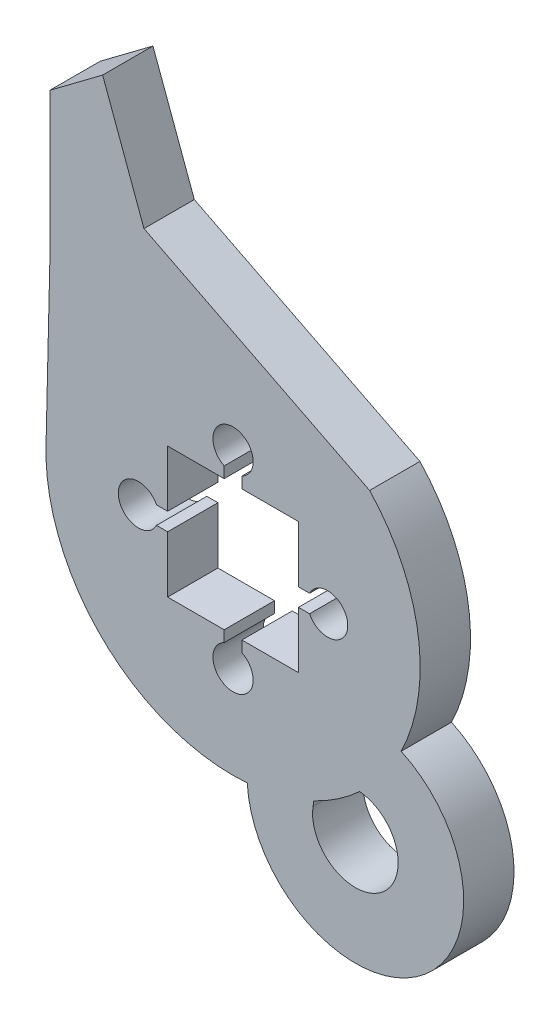
ISO-10303-21;
HEADER;
FILE_DESCRIPTION(('STEP AP214'),'2;1');
FILE_NAME('part.step','',(''),(''),'','','');
FILE_SCHEMA(('AUTOMOTIVE_DESIGN { 1 0 10303 214 1 1 1 1 }'));
ENDSEC;
DATA;
#1=APPLICATION_CONTEXT('core data for automotive mechanical design processes');
#2=APPLICATION_PROTOCOL_DEFINITION('international standard','automotive_design',2000,#1);
#3=PRODUCT_CONTEXT('',#1,'mechanical');
#4=PRODUCT('Part','Part','',(#3));
#5=PRODUCT_RELATED_PRODUCT_CATEGORY('part','',(#4));
#6=PRODUCT_DEFINITION_FORMATION('','',#4);
#7=PRODUCT_DEFINITION_CONTEXT('part definition',#1,'design');
#8=PRODUCT_DEFINITION('design','',#6,#7);
#9=PRODUCT_DEFINITION_SHAPE('','',#8);
#10=(LENGTH_UNIT() NAMED_UNIT(*) SI_UNIT(.MILLI.,.METRE.));
#11=(NAMED_UNIT(*) PLANE_ANGLE_UNIT() SI_UNIT($,.RADIAN.));
#12=(NAMED_UNIT(*) SI_UNIT($,.STERADIAN.) SOLID_ANGLE_UNIT());
#13=UNCERTAINTY_MEASURE_WITH_UNIT(LENGTH_MEASURE(1.E-05),#10,'distance_accuracy_value','');
#14=(GEOMETRIC_REPRESENTATION_CONTEXT(3) GLOBAL_UNCERTAINTY_ASSIGNED_CONTEXT((#13)) GLOBAL_UNIT_ASSIGNED_CONTEXT((#10,
#11,#12)) REPRESENTATION_CONTEXT('',''));
#15=CARTESIAN_POINT('',(0.,0.,0.));
#16=DIRECTION('',(0.,0.,1.));
#17=DIRECTION('',(1.,0.,0.));
#18=AXIS2_PLACEMENT_3D('',#15,#16,#17);
#19=CARTESIAN_POINT('',(0.,0.,6.35));
#20=DIRECTION('',(0.,0.,-1.));
#21=DIRECTION('',(-1.,0.,0.));
#22=AXIS2_PLACEMENT_3D('',#19,#20,#21);
#23=CYLINDRICAL_SURFACE('',#22,23.6135427551145);
#24=DIRECTION('',(0.,0.,-1.));
#25=VECTOR('',#24,1.);
#26=CARTESIAN_POINT('',(15.9784402053328,-17.3864559370858,3.175));
#27=LINE('',#26,#25);
#28=CARTESIAN_POINT('',(15.9784402053328,-17.3864559370858,6.35));
#29=VERTEX_POINT('',#28);
#30=CARTESIAN_POINT('',(15.9784402053328,-17.3864559370858,0.));
#31=VERTEX_POINT('',#30);
#32=EDGE_CURVE('E65',#29,#31,#27,.T.);
#33=ORIENTED_EDGE('',*,*,#32,.F.);
#34=CARTESIAN_POINT('',(0.,0.,6.35));
#35=DIRECTION('',(0.,0.,1.));
#36=DIRECTION('',(1.,0.,0.));
#37=AXIS2_PLACEMENT_3D('',#34,#35,#36);
#38=CIRCLE('',#37,23.6135427551145);
#39=CARTESIAN_POINT('',(10.1574341685378,-21.317268412239,6.35));
#40=VERTEX_POINT('',#39);
#41=EDGE_CURVE('E251',#40,#29,#38,.T.);
#42=ORIENTED_EDGE('',*,*,#41,.F.);
#43=DIRECTION('',(0.,0.,-1.));
#44=VECTOR('',#43,1.);
#45=CARTESIAN_POINT('',(10.1574341685378,-21.317268412239,3.175));
#46=LINE('',#45,#44);
#47=CARTESIAN_POINT('',(10.1574341685378,-21.317268412239,0.));
#48=VERTEX_POINT('',#47);
#49=EDGE_CURVE('E262',#40,#48,#46,.T.);
#50=ORIENTED_EDGE('',*,*,#49,.T.);
#51=CARTESIAN_POINT('',(0.,0.,0.));
#52=DIRECTION('',(0.,0.,1.));
#53=DIRECTION('',(1.,0.,0.));
#54=AXIS2_PLACEMENT_3D('',#51,#52,#53);
#55=CIRCLE('',#54,23.6135427551145);
#56=EDGE_CURVE('E411',#48,#31,#55,.T.);
#57=ORIENTED_EDGE('',*,*,#56,.T.);
#58=EDGE_LOOP('',(#33,#42,#50,#57));
#59=FACE_BOUND('',#58,.T.);
#60=ADVANCED_FACE('F40',(#59),#23,.T.);
#61=CARTESIAN_POINT('',(-23.5873627776474,1.11162882441667,0.));
#62=VERTEX_POINT('',#61);
#63=CARTESIAN_POINT('',(1.78936869988122,-23.5456484536635,0.));
#64=VERTEX_POINT('',#63);
#65=EDGE_CURVE('E408',#62,#64,#55,.T.);
#66=ORIENTED_EDGE('',*,*,#65,.T.);
#67=DIRECTION('',(0.,0.,-1.));
#68=VECTOR('',#67,1.);
#69=CARTESIAN_POINT('',(1.78936869988122,-23.5456484536635,3.175));
#70=LINE('',#69,#68);
#71=CARTESIAN_POINT('',(1.78936869988122,-23.5456484536635,6.35));
#72=VERTEX_POINT('',#71);
#73=EDGE_CURVE('E271',#64,#72,#70,.F.);
#74=ORIENTED_EDGE('',*,*,#73,.T.);
#75=CARTESIAN_POINT('',(-23.5873627776474,1.11162882441667,6.35));
#76=VERTEX_POINT('',#75);
#77=EDGE_CURVE('E336',#76,#72,#38,.T.);
#78=ORIENTED_EDGE('',*,*,#77,.F.);
#79=DIRECTION('',(0.,0.,-1.));
#80=VECTOR('',#79,1.);
#81=CARTESIAN_POINT('',(-23.5873627776474,1.11162882441667,6.35));
#82=LINE('',#81,#80);
#83=EDGE_CURVE('E11',#76,#62,#82,.T.);
#84=ORIENTED_EDGE('',*,*,#83,.T.);
#85=EDGE_LOOP('',(#66,#74,#78,#84));
#86=FACE_BOUND('',#85,.T.);
#87=ADVANCED_FACE('F568',(#86),#23,.T.);
#88=CARTESIAN_POINT('',(-23.600452766381,0.555814412208336,6.35));
#89=DIRECTION('',(0.9997227903611,-0.0235444777520275,0.));
#90=DIRECTION('',(0.0235444777520275,0.9997227903611,0.));
#91=AXIS2_PLACEMENT_3D('',#88,#89,#90);
#92=PLANE('',#91);
#93=DIRECTION('',(-0.0235444777520275,-0.9997227903611,0.));
#94=VECTOR('',#93,1.);
#95=CARTESIAN_POINT('',(-23.600452766381,0.555814412208336,0.));
#96=LINE('',#95,#94);
#97=CARTESIAN_POINT('',(-23.0807397820959,22.6233633427269,0.));
#98=VERTEX_POINT('',#97);
#99=EDGE_CURVE('E404',#98,#62,#96,.T.);
#100=ORIENTED_EDGE('',*,*,#99,.T.);
#101=ORIENTED_EDGE('',*,*,#83,.F.);
#102=DIRECTION('',(-0.0235444777520275,-0.9997227903611,0.));
#103=VECTOR('',#102,1.);
#104=CARTESIAN_POINT('',(-23.600452766381,0.555814412208336,6.35));
#105=LINE('',#104,#103);
#106=CARTESIAN_POINT('',(-23.0807397820959,22.6233633427269,6.35));
#107=VERTEX_POINT('',#106);
#108=EDGE_CURVE('E333',#107,#76,#105,.T.);
#109=ORIENTED_EDGE('',*,*,#108,.F.);
#110=DIRECTION('',(0.,0.,-1.));
#111=VECTOR('',#110,1.);
#112=CARTESIAN_POINT('',(-23.0807397820959,22.6233633427269,6.35));
#113=LINE('',#112,#111);
#114=EDGE_CURVE('E418',#107,#98,#113,.T.);
#115=ORIENTED_EDGE('',*,*,#114,.T.);
#116=EDGE_LOOP('',(#100,#101,#109,#115));
#117=FACE_BOUND('',#116,.T.);
#118=ADVANCED_FACE('F574',(#117),#92,.F.);
#119=CARTESIAN_POINT('',(21.2141693512526,-10.371037565451,6.35));
#120=VERTEX_POINT('',#119);
#121=CARTESIAN_POINT('',(17.2333916296905,16.1434077686631,6.35));
#122=VERTEX_POINT('',#121);
#123=EDGE_CURVE('E57',#120,#122,#38,.T.);
#124=ORIENTED_EDGE('',*,*,#123,.F.);
#125=DIRECTION('',(0.,0.,-1.));
#126=VECTOR('',#125,1.);
#127=CARTESIAN_POINT('',(21.2141693512526,-10.371037565451,3.175));
#128=LINE('',#127,#126);
#129=CARTESIAN_POINT('',(21.2141693512526,-10.371037565451,0.));
#130=VERTEX_POINT('',#129);
#131=EDGE_CURVE('E269',#120,#130,#128,.T.);
#132=ORIENTED_EDGE('',*,*,#131,.T.);
#133=CARTESIAN_POINT('',(17.2333916296905,16.1434077686631,0.));
#134=VERTEX_POINT('',#133);
#135=EDGE_CURVE('E407',#130,#134,#55,.T.);
#136=ORIENTED_EDGE('',*,*,#135,.T.);
#137=DIRECTION('',(0.,0.,-1.));
#138=VECTOR('',#137,1.);
#139=CARTESIAN_POINT('',(17.2333916296905,16.1434077686631,6.35));
#140=LINE('',#139,#138);
#141=EDGE_CURVE('E49',#122,#134,#140,.T.);
#142=ORIENTED_EDGE('',*,*,#141,.F.);
#143=EDGE_LOOP('',(#124,#132,#136,#142));
#144=FACE_BOUND('',#143,.T.);
#145=ADVANCED_FACE('F570',(#144),#23,.T.);
#146=CARTESIAN_POINT('',(9.99702081095458,19.7975110321155,6.35));
#147=DIRECTION('',(-0.450754622668635,-0.892647898189906,0.));
#148=DIRECTION('',(0.892647898189906,-0.450754622668635,0.));
#149=AXIS2_PLACEMENT_3D('',#146,#147,#148);
#150=PLANE('',#149);
#151=DIRECTION('',(-0.892647898189906,0.450754622668635,0.));
#152=VECTOR('',#151,1.);
#153=CARTESIAN_POINT('',(9.99702081095458,19.7975110321155,0.));
#154=LINE('',#153,#152);
#155=CARTESIAN_POINT('',(-11.2389809229268,30.5209171679016,0.));
#156=VERTEX_POINT('',#155);
#157=EDGE_CURVE('E410',#134,#156,#154,.T.);
#158=ORIENTED_EDGE('',*,*,#157,.T.);
#159=DIRECTION('',(0.,0.,-1.));
#160=VECTOR('',#159,1.);
#161=CARTESIAN_POINT('',(-11.2389809229268,30.5209171679016,6.35));
#162=LINE('',#161,#160);
#163=CARTESIAN_POINT('',(-11.2389809229268,30.5209171679016,6.35));
#164=VERTEX_POINT('',#163);
#165=EDGE_CURVE('E427',#164,#156,#162,.T.);
#166=ORIENTED_EDGE('',*,*,#165,.F.);
#167=DIRECTION('',(-0.892647898189906,0.450754622668635,0.));
#168=VECTOR('',#167,1.);
#169=CARTESIAN_POINT('',(9.99702081095458,19.7975110321155,6.35));
#170=LINE('',#169,#168);
#171=EDGE_CURVE('E339',#122,#164,#170,.T.);
#172=ORIENTED_EDGE('',*,*,#171,.F.);
#173=ORIENTED_EDGE('',*,*,#141,.T.);
#174=EDGE_LOOP('',(#158,#166,#172,#173));
#175=FACE_BOUND('',#174,.T.);
#176=ADVANCED_FACE('F579',(#175),#150,.F.);
#177=CARTESIAN_POINT('',(0.,0.,6.35));
#178=DIRECTION('',(-0.938398633522792,-0.345554633310792,0.));
#179=DIRECTION('',(0.345554633310792,-0.938398633522793,0.));
#180=AXIS2_PLACEMENT_3D('',#177,#178,#179);
#181=PLANE('',#180);
#182=DIRECTION('',(-0.345554633310792,0.938398633522793,0.));
#183=VECTOR('',#182,1.);
#184=CARTESIAN_POINT('',(0.,0.,0.));
#185=LINE('',#184,#183);
#186=CARTESIAN_POINT('',(-16.4570394114265,44.691234921523,0.));
#187=VERTEX_POINT('',#186);
#188=EDGE_CURVE('E413',#156,#187,#185,.T.);
#189=ORIENTED_EDGE('',*,*,#188,.T.);
#190=DIRECTION('',(0.,0.,-1.));
#191=VECTOR('',#190,1.);
#192=CARTESIAN_POINT('',(-16.4570394114265,44.691234921523,6.35));
#193=LINE('',#192,#191);
#194=CARTESIAN_POINT('',(-16.4570394114265,44.691234921523,6.35));
#195=VERTEX_POINT('',#194);
#196=EDGE_CURVE('E424',#195,#187,#193,.T.);
#197=ORIENTED_EDGE('',*,*,#196,.F.);
#198=DIRECTION('',(-0.345554633310792,0.938398633522793,0.));
#199=VECTOR('',#198,1.);
#200=CARTESIAN_POINT('',(0.,0.,6.35));
#201=LINE('',#200,#199);
#202=EDGE_CURVE('E341',#164,#195,#201,.T.);
#203=ORIENTED_EDGE('',*,*,#202,.F.);
#204=ORIENTED_EDGE('',*,*,#165,.T.);
#205=EDGE_LOOP('',(#189,#197,#203,#204));
#206=FACE_BOUND('',#205,.T.);
#207=ADVANCED_FACE('F584',(#206),#181,.F.);
#208=CARTESIAN_POINT('',(-27.3756816624643,36.5026420511175,6.35));
#209=DIRECTION('',(0.599981766977011,-0.800013674442596,0.));
#210=DIRECTION('',(0.800013674442596,0.599981766977011,0.));
#211=AXIS2_PLACEMENT_3D('',#208,#209,#210);
#212=PLANE('',#211);
#213=DIRECTION('',(-0.800013674442596,-0.599981766977011,0.));
#214=VECTOR('',#213,1.);
#215=CARTESIAN_POINT('',(-27.3756816624643,36.5026420511175,0.));
#216=LINE('',#215,#214);
#217=CARTESIAN_POINT('',(-23.1206338335875,39.6937763985647,0.));
#218=VERTEX_POINT('',#217);
#219=EDGE_CURVE('E415',#187,#218,#216,.T.);
#220=ORIENTED_EDGE('',*,*,#219,.T.);
#221=DIRECTION('',(0.,0.,-1.));
#222=VECTOR('',#221,1.);
#223=CARTESIAN_POINT('',(-23.1206338335875,39.6937763985647,6.35));
#224=LINE('',#223,#222);
#225=CARTESIAN_POINT('',(-23.1206338335875,39.6937763985647,6.35));
#226=VERTEX_POINT('',#225);
#227=EDGE_CURVE('E421',#226,#218,#224,.T.);
#228=ORIENTED_EDGE('',*,*,#227,.F.);
#229=DIRECTION('',(-0.800013674442596,-0.599981766977011,0.));
#230=VECTOR('',#229,1.);
#231=CARTESIAN_POINT('',(-27.3756816624643,36.5026420511175,6.35));
#232=LINE('',#231,#230);
#233=EDGE_CURVE('E343',#195,#226,#232,.T.);
#234=ORIENTED_EDGE('',*,*,#233,.F.);
#235=ORIENTED_EDGE('',*,*,#196,.T.);
#236=EDGE_LOOP('',(#220,#228,#234,#235));
#237=FACE_BOUND('',#236,.T.);
#238=ADVANCED_FACE('F609',(#237),#212,.F.);
#239=CARTESIAN_POINT('',(0.,11.938,6.35));
#240=DIRECTION('',(0.,0.,-1.));
#241=DIRECTION('',(-1.,0.,0.));
#242=AXIS2_PLACEMENT_3D('',#239,#240,#241);
#243=CYLINDRICAL_SURFACE('',#242,2.54);
#244=CARTESIAN_POINT('',(0.,11.938,0.));
#245=DIRECTION('',(0.,0.,1.));
#246=DIRECTION('',(1.,0.,0.));
#247=AXIS2_PLACEMENT_3D('',#244,#245,#246);
#248=CIRCLE('',#247,2.54);
#249=CARTESIAN_POINT('',(1.1176,9.65708565702261,0.));
#250=VERTEX_POINT('',#249);
#251=CARTESIAN_POINT('',(-1.1176,9.65708565702261,0.));
#252=VERTEX_POINT('',#251);
#253=EDGE_CURVE('E279',#250,#252,#248,.T.);
#254=ORIENTED_EDGE('',*,*,#253,.F.);
#255=DIRECTION('',(0.,0.,-1.));
#256=VECTOR('',#255,1.);
#257=CARTESIAN_POINT('',(1.1176,9.65708565702261,6.35));
#258=LINE('',#257,#256);
#259=CARTESIAN_POINT('',(1.1176,9.65708565702261,6.35));
#260=VERTEX_POINT('',#259);
#261=EDGE_CURVE('E44',#260,#250,#258,.T.);
#262=ORIENTED_EDGE('',*,*,#261,.F.);
#263=CARTESIAN_POINT('',(0.,11.938,6.35));
#264=DIRECTION('',(0.,0.,1.));
#265=DIRECTION('',(1.,0.,0.));
#266=AXIS2_PLACEMENT_3D('',#263,#264,#265);
#267=CIRCLE('',#266,2.54);
#268=CARTESIAN_POINT('',(-1.1176,9.65708565702261,6.35));
#269=VERTEX_POINT('',#268);
#270=EDGE_CURVE('E280',#260,#269,#267,.T.);
#271=ORIENTED_EDGE('',*,*,#270,.T.);
#272=DIRECTION('',(0.,0.,-1.));
#273=VECTOR('',#272,1.);
#274=CARTESIAN_POINT('',(-1.1176,9.65708565702261,6.35));
#275=LINE('',#274,#273);
#276=EDGE_CURVE('E347',#269,#252,#275,.T.);
#277=ORIENTED_EDGE('',*,*,#276,.T.);
#278=EDGE_LOOP('',(#254,#262,#271,#277));
#279=FACE_BOUND('',#278,.T.);
#280=ADVANCED_FACE('F42',(#279),#243,.F.);
#281=CARTESIAN_POINT('',(1.1176,0.,6.35));
#282=DIRECTION('',(1.,0.,0.));
#283=DIRECTION('',(0.,1.,0.));
#284=AXIS2_PLACEMENT_3D('',#281,#282,#283);
#285=PLANE('',#284);
#286=DIRECTION('',(0.,-1.,0.));
#287=VECTOR('',#286,1.);
#288=CARTESIAN_POINT('',(1.1176,0.,0.));
#289=LINE('',#288,#287);
#290=CARTESIAN_POINT('',(1.1176,8.255,0.));
#291=VERTEX_POINT('',#290);
#292=EDGE_CURVE('E350',#250,#291,#289,.T.);
#293=ORIENTED_EDGE('',*,*,#292,.T.);
#294=DIRECTION('',(0.,0.,-1.));
#295=VECTOR('',#294,1.);
#296=CARTESIAN_POINT('',(1.1176,8.255,6.35));
#297=LINE('',#296,#295);
#298=CARTESIAN_POINT('',(1.1176,8.255,6.35));
#299=VERTEX_POINT('',#298);
#300=EDGE_CURVE('E468',#299,#291,#297,.T.);
#301=ORIENTED_EDGE('',*,*,#300,.F.);
#302=DIRECTION('',(0.,-1.,0.));
#303=VECTOR('',#302,1.);
#304=CARTESIAN_POINT('',(1.1176,0.,6.35));
#305=LINE('',#304,#303);
#306=EDGE_CURVE('E283',#260,#299,#305,.T.);
#307=ORIENTED_EDGE('',*,*,#306,.F.);
#308=ORIENTED_EDGE('',*,*,#261,.T.);
#309=EDGE_LOOP('',(#293,#301,#307,#308));
#310=FACE_BOUND('',#309,.T.);
#311=ADVANCED_FACE('F477',(#310),#285,.F.);
#312=CARTESIAN_POINT('',(0.,8.255,6.35));
#313=DIRECTION('',(0.,1.,0.));
#314=DIRECTION('',(0.,0.,1.));
#315=AXIS2_PLACEMENT_3D('',#312,#313,#314);
#316=PLANE('',#315);
#317=DIRECTION('',(1.,0.,0.));
#318=VECTOR('',#317,1.);
#319=CARTESIAN_POINT('',(0.,8.255,0.));
#320=LINE('',#319,#318);
#321=CARTESIAN_POINT('',(8.255,8.255,0.));
#322=VERTEX_POINT('',#321);
#323=EDGE_CURVE('E352',#291,#322,#320,.T.);
#324=ORIENTED_EDGE('',*,*,#323,.T.);
#325=DIRECTION('',(0.,0.,-1.));
#326=VECTOR('',#325,1.);
#327=CARTESIAN_POINT('',(8.255,8.255,6.35));
#328=LINE('',#327,#326);
#329=CARTESIAN_POINT('',(8.255,8.255,6.35));
#330=VERTEX_POINT('',#329);
#331=EDGE_CURVE('E466',#330,#322,#328,.T.);
#332=ORIENTED_EDGE('',*,*,#331,.F.);
#333=DIRECTION('',(1.,0.,0.));
#334=VECTOR('',#333,1.);
#335=CARTESIAN_POINT('',(0.,8.255,6.35));
#336=LINE('',#335,#334);
#337=EDGE_CURVE('E286',#299,#330,#336,.T.);
#338=ORIENTED_EDGE('',*,*,#337,.F.);
#339=ORIENTED_EDGE('',*,*,#300,.T.);
#340=EDGE_LOOP('',(#324,#332,#338,#339));
#341=FACE_BOUND('',#340,.T.);
#342=ADVANCED_FACE('F556',(#341),#316,.F.);
#343=CARTESIAN_POINT('',(8.255,0.,6.35));
#344=DIRECTION('',(1.,0.,0.));
#345=DIRECTION('',(0.,0.,-1.));
#346=AXIS2_PLACEMENT_3D('',#343,#344,#345);
#347=PLANE('',#346);
#348=DIRECTION('',(0.,-1.,0.));
#349=VECTOR('',#348,1.);
#350=CARTESIAN_POINT('',(8.255,0.,0.));
#351=LINE('',#350,#349);
#352=CARTESIAN_POINT('',(8.255,1.1176,0.));
#353=VERTEX_POINT('',#352);
#354=EDGE_CURVE('E354',#322,#353,#351,.T.);
#355=ORIENTED_EDGE('',*,*,#354,.T.);
#356=DIRECTION('',(0.,0.,-1.));
#357=VECTOR('',#356,1.);
#358=CARTESIAN_POINT('',(8.255,1.1176,6.35));
#359=LINE('',#358,#357);
#360=CARTESIAN_POINT('',(8.255,1.1176,6.35));
#361=VERTEX_POINT('',#360);
#362=EDGE_CURVE('E463',#361,#353,#359,.T.);
#363=ORIENTED_EDGE('',*,*,#362,.F.);
#364=DIRECTION('',(0.,-1.,0.));
#365=VECTOR('',#364,1.);
#366=CARTESIAN_POINT('',(8.255,0.,6.35));
#367=LINE('',#366,#365);
#368=EDGE_CURVE('E288',#330,#361,#367,.T.);
#369=ORIENTED_EDGE('',*,*,#368,.F.);
#370=ORIENTED_EDGE('',*,*,#331,.T.);
#371=EDGE_LOOP('',(#355,#363,#369,#370));
#372=FACE_BOUND('',#371,.T.);
#373=ADVANCED_FACE('F554',(#372),#347,.F.);
#374=CARTESIAN_POINT('',(0.,1.1176,6.35));
#375=DIRECTION('',(0.,1.,0.));
#376=DIRECTION('',(0.,0.,1.));
#377=AXIS2_PLACEMENT_3D('',#374,#375,#376);
#378=PLANE('',#377);
#379=DIRECTION('',(1.,0.,0.));
#380=VECTOR('',#379,1.);
#381=CARTESIAN_POINT('',(0.,1.1176,0.));
#382=LINE('',#381,#380);
#383=CARTESIAN_POINT('',(9.6570856570226,1.1176,0.));
#384=VERTEX_POINT('',#383);
#385=EDGE_CURVE('E356',#353,#384,#382,.T.);
#386=ORIENTED_EDGE('',*,*,#385,.T.);
#387=DIRECTION('',(0.,0.,-1.));
#388=VECTOR('',#387,1.);
#389=CARTESIAN_POINT('',(9.6570856570226,1.1176,6.35));
#390=LINE('',#389,#388);
#391=CARTESIAN_POINT('',(9.6570856570226,1.1176,6.35));
#392=VERTEX_POINT('',#391);
#393=EDGE_CURVE('E461',#392,#384,#390,.T.);
#394=ORIENTED_EDGE('',*,*,#393,.F.);
#395=DIRECTION('',(1.,0.,0.));
#396=VECTOR('',#395,1.);
#397=CARTESIAN_POINT('',(0.,1.1176,6.35));
#398=LINE('',#397,#396);
#399=EDGE_CURVE('E290',#361,#392,#398,.T.);
#400=ORIENTED_EDGE('',*,*,#399,.F.);
#401=ORIENTED_EDGE('',*,*,#362,.T.);
#402=EDGE_LOOP('',(#386,#394,#400,#401));
#403=FACE_BOUND('',#402,.T.);
#404=ADVANCED_FACE('F549',(#403),#378,.F.);
#405=CARTESIAN_POINT('',(11.938,0.,6.35));
#406=DIRECTION('',(0.,0.,-1.));
#407=DIRECTION('',(-1.,0.,0.));
#408=AXIS2_PLACEMENT_3D('',#405,#406,#407);
#409=CYLINDRICAL_SURFACE('',#408,2.54);
#410=CARTESIAN_POINT('',(11.938,0.,0.));
#411=DIRECTION('',(0.,0.,1.));
#412=DIRECTION('',(1.,0.,0.));
#413=AXIS2_PLACEMENT_3D('',#410,#411,#412);
#414=CIRCLE('',#413,2.54);
#415=CARTESIAN_POINT('',(9.6570856570226,-1.1176,0.));
#416=VERTEX_POINT('',#415);
#417=EDGE_CURVE('E359',#416,#384,#414,.T.);
#418=ORIENTED_EDGE('',*,*,#417,.F.);
#419=DIRECTION('',(0.,0.,-1.));
#420=VECTOR('',#419,1.);
#421=CARTESIAN_POINT('',(9.6570856570226,-1.1176,6.35));
#422=LINE('',#421,#420);
#423=CARTESIAN_POINT('',(9.6570856570226,-1.1176,6.35));
#424=VERTEX_POINT('',#423);
#425=EDGE_CURVE('E459',#424,#416,#422,.T.);
#426=ORIENTED_EDGE('',*,*,#425,.F.);
#427=CARTESIAN_POINT('',(11.938,0.,6.35));
#428=DIRECTION('',(0.,0.,1.));
#429=DIRECTION('',(1.,0.,0.));
#430=AXIS2_PLACEMENT_3D('',#427,#428,#429);
#431=CIRCLE('',#430,2.54);
#432=EDGE_CURVE('E292',#424,#392,#431,.T.);
#433=ORIENTED_EDGE('',*,*,#432,.T.);
#434=ORIENTED_EDGE('',*,*,#393,.T.);
#435=EDGE_LOOP('',(#418,#426,#433,#434));
#436=FACE_BOUND('',#435,.T.);
#437=ADVANCED_FACE('F545',(#436),#409,.F.);
#438=CARTESIAN_POINT('',(0.,-1.1176,6.35));
#439=DIRECTION('',(0.,1.,0.));
#440=DIRECTION('',(0.,0.,1.));
#441=AXIS2_PLACEMENT_3D('',#438,#439,#440);
#442=PLANE('',#441);
#443=DIRECTION('',(1.,0.,0.));
#444=VECTOR('',#443,1.);
#445=CARTESIAN_POINT('',(0.,-1.1176,0.));
#446=LINE('',#445,#444);
#447=CARTESIAN_POINT('',(8.255,-1.1176,0.));
#448=VERTEX_POINT('',#447);
#449=EDGE_CURVE('E362',#448,#416,#446,.T.);
#450=ORIENTED_EDGE('',*,*,#449,.F.);
#451=DIRECTION('',(0.,0.,-1.));
#452=VECTOR('',#451,1.);
#453=CARTESIAN_POINT('',(8.255,-1.1176,6.35));
#454=LINE('',#453,#452);
#455=CARTESIAN_POINT('',(8.255,-1.1176,6.35));
#456=VERTEX_POINT('',#455);
#457=EDGE_CURVE('E457',#456,#448,#454,.T.);
#458=ORIENTED_EDGE('',*,*,#457,.F.);
#459=DIRECTION('',(1.,0.,0.));
#460=VECTOR('',#459,1.);
#461=CARTESIAN_POINT('',(0.,-1.1176,6.35));
#462=LINE('',#461,#460);
#463=EDGE_CURVE('E295',#456,#424,#462,.T.);
#464=ORIENTED_EDGE('',*,*,#463,.T.);
#465=ORIENTED_EDGE('',*,*,#425,.T.);
#466=EDGE_LOOP('',(#450,#458,#464,#465));
#467=FACE_BOUND('',#466,.T.);
#468=ADVANCED_FACE('F539',(#467),#442,.T.);
#469=CARTESIAN_POINT('',(8.255,0.,6.35));
#470=DIRECTION('',(1.,0.,0.));
#471=DIRECTION('',(0.,0.,-1.));
#472=AXIS2_PLACEMENT_3D('',#469,#470,#471);
#473=PLANE('',#472);
#474=DIRECTION('',(0.,-1.,0.));
#475=VECTOR('',#474,1.);
#476=CARTESIAN_POINT('',(8.255,0.,0.));
#477=LINE('',#476,#475);
#478=CARTESIAN_POINT('',(8.255,-8.255,0.));
#479=VERTEX_POINT('',#478);
#480=EDGE_CURVE('E365',#448,#479,#477,.T.);
#481=ORIENTED_EDGE('',*,*,#480,.T.);
#482=DIRECTION('',(0.,0.,-1.));
#483=VECTOR('',#482,1.);
#484=CARTESIAN_POINT('',(8.255,-8.255,6.35));
#485=LINE('',#484,#483);
#486=CARTESIAN_POINT('',(8.255,-8.255,6.35));
#487=VERTEX_POINT('',#486);
#488=EDGE_CURVE('E455',#487,#479,#485,.T.);
#489=ORIENTED_EDGE('',*,*,#488,.F.);
#490=DIRECTION('',(0.,-1.,0.));
#491=VECTOR('',#490,1.);
#492=CARTESIAN_POINT('',(8.255,0.,6.35));
#493=LINE('',#492,#491);
#494=EDGE_CURVE('E298',#456,#487,#493,.T.);
#495=ORIENTED_EDGE('',*,*,#494,.F.);
#496=ORIENTED_EDGE('',*,*,#457,.T.);
#497=EDGE_LOOP('',(#481,#489,#495,#496));
#498=FACE_BOUND('',#497,.T.);
#499=ADVANCED_FACE('F687',(#498),#473,.F.);
#500=CARTESIAN_POINT('',(0.,-8.255,6.35));
#501=DIRECTION('',(0.,1.,0.));
#502=DIRECTION('',(0.,0.,1.));
#503=AXIS2_PLACEMENT_3D('',#500,#501,#502);
#504=PLANE('',#503);
#505=DIRECTION('',(1.,0.,0.));
#506=VECTOR('',#505,1.);
#507=CARTESIAN_POINT('',(0.,-8.255,0.));
#508=LINE('',#507,#506);
#509=CARTESIAN_POINT('',(1.1176,-8.255,0.));
#510=VERTEX_POINT('',#509);
#511=EDGE_CURVE('E368',#510,#479,#508,.T.);
#512=ORIENTED_EDGE('',*,*,#511,.F.);
#513=DIRECTION('',(0.,0.,-1.));
#514=VECTOR('',#513,1.);
#515=CARTESIAN_POINT('',(1.1176,-8.255,6.35));
#516=LINE('',#515,#514);
#517=CARTESIAN_POINT('',(1.1176,-8.255,6.35));
#518=VERTEX_POINT('',#517);
#519=EDGE_CURVE('E453',#518,#510,#516,.T.);
#520=ORIENTED_EDGE('',*,*,#519,.F.);
#521=DIRECTION('',(1.,0.,0.));
#522=VECTOR('',#521,1.);
#523=CARTESIAN_POINT('',(0.,-8.255,6.35));
#524=LINE('',#523,#522);
#525=EDGE_CURVE('E300',#518,#487,#524,.T.);
#526=ORIENTED_EDGE('',*,*,#525,.T.);
#527=ORIENTED_EDGE('',*,*,#488,.T.);
#528=EDGE_LOOP('',(#512,#520,#526,#527));
#529=FACE_BOUND('',#528,.T.);
#530=ADVANCED_FACE('F533',(#529),#504,.T.);
#531=CARTESIAN_POINT('',(1.11760000000001,0.,6.35));
#532=DIRECTION('',(1.,0.,0.));
#533=DIRECTION('',(0.,1.,0.));
#534=AXIS2_PLACEMENT_3D('',#531,#532,#533);
#535=PLANE('',#534);
#536=DIRECTION('',(0.,-1.,0.));
#537=VECTOR('',#536,1.);
#538=CARTESIAN_POINT('',(1.11760000000001,0.,0.));
#539=LINE('',#538,#537);
#540=CARTESIAN_POINT('',(1.1176,-9.65708565702261,0.));
#541=VERTEX_POINT('',#540);
#542=EDGE_CURVE('E371',#510,#541,#539,.T.);
#543=ORIENTED_EDGE('',*,*,#542,.T.);
#544=DIRECTION('',(0.,0.,-1.));
#545=VECTOR('',#544,1.);
#546=CARTESIAN_POINT('',(1.1176,-9.65708565702261,6.35));
#547=LINE('',#546,#545);
#548=CARTESIAN_POINT('',(1.1176,-9.65708565702261,6.35));
#549=VERTEX_POINT('',#548);
#550=EDGE_CURVE('E451',#549,#541,#547,.T.);
#551=ORIENTED_EDGE('',*,*,#550,.F.);
#552=DIRECTION('',(0.,-1.,0.));
#553=VECTOR('',#552,1.);
#554=CARTESIAN_POINT('',(1.11760000000001,0.,6.35));
#555=LINE('',#554,#553);
#556=EDGE_CURVE('E303',#518,#549,#555,.T.);
#557=ORIENTED_EDGE('',*,*,#556,.F.);
#558=ORIENTED_EDGE('',*,*,#519,.T.);
#559=EDGE_LOOP('',(#543,#551,#557,#558));
#560=FACE_BOUND('',#559,.T.);
#561=ADVANCED_FACE('F530',(#560),#535,.F.);
#562=CARTESIAN_POINT('',(0.,-11.938,6.35));
#563=DIRECTION('',(0.,0.,-1.));
#564=DIRECTION('',(-1.,0.,0.));
#565=AXIS2_PLACEMENT_3D('',#562,#563,#564);
#566=CYLINDRICAL_SURFACE('',#565,2.54);
#567=CARTESIAN_POINT('',(0.,-11.938,0.));
#568=DIRECTION('',(0.,0.,1.));
#569=DIRECTION('',(1.,0.,0.));
#570=AXIS2_PLACEMENT_3D('',#567,#568,#569);
#571=CIRCLE('',#570,2.54);
#572=CARTESIAN_POINT('',(-1.1176,-9.65708565702261,0.));
#573=VERTEX_POINT('',#572);
#574=EDGE_CURVE('E374',#573,#541,#571,.T.);
#575=ORIENTED_EDGE('',*,*,#574,.F.);
#576=DIRECTION('',(0.,0.,-1.));
#577=VECTOR('',#576,1.);
#578=CARTESIAN_POINT('',(-1.1176,-9.65708565702261,6.35));
#579=LINE('',#578,#577);
#580=CARTESIAN_POINT('',(-1.1176,-9.65708565702261,6.35));
#581=VERTEX_POINT('',#580);
#582=EDGE_CURVE('E449',#581,#573,#579,.T.);
#583=ORIENTED_EDGE('',*,*,#582,.F.);
#584=CARTESIAN_POINT('',(0.,-11.938,6.35));
#585=DIRECTION('',(0.,0.,1.));
#586=DIRECTION('',(1.,0.,0.));
#587=AXIS2_PLACEMENT_3D('',#584,#585,#586);
#588=CIRCLE('',#587,2.54);
#589=EDGE_CURVE('E305',#581,#549,#588,.T.);
#590=ORIENTED_EDGE('',*,*,#589,.T.);
#591=ORIENTED_EDGE('',*,*,#550,.T.);
#592=EDGE_LOOP('',(#575,#583,#590,#591));
#593=FACE_BOUND('',#592,.T.);
#594=ADVANCED_FACE('F525',(#593),#566,.F.);
#595=CARTESIAN_POINT('',(-1.1176,0.,6.35));
#596=DIRECTION('',(1.,0.,0.));
#597=DIRECTION('',(0.,0.,-1.));
#598=AXIS2_PLACEMENT_3D('',#595,#596,#597);
#599=PLANE('',#598);
#600=DIRECTION('',(0.,-1.,0.));
#601=VECTOR('',#600,1.);
#602=CARTESIAN_POINT('',(-1.1176,0.,0.));
#603=LINE('',#602,#601);
#604=CARTESIAN_POINT('',(-1.1176,-8.255,0.));
#605=VERTEX_POINT('',#604);
#606=EDGE_CURVE('E377',#605,#573,#603,.T.);
#607=ORIENTED_EDGE('',*,*,#606,.F.);
#608=DIRECTION('',(0.,0.,-1.));
#609=VECTOR('',#608,1.);
#610=CARTESIAN_POINT('',(-1.1176,-8.255,6.35));
#611=LINE('',#610,#609);
#612=CARTESIAN_POINT('',(-1.1176,-8.255,6.35));
#613=VERTEX_POINT('',#612);
#614=EDGE_CURVE('E447',#613,#605,#611,.T.);
#615=ORIENTED_EDGE('',*,*,#614,.F.);
#616=DIRECTION('',(0.,-1.,0.));
#617=VECTOR('',#616,1.);
#618=CARTESIAN_POINT('',(-1.1176,0.,6.35));
#619=LINE('',#618,#617);
#620=EDGE_CURVE('E308',#613,#581,#619,.T.);
#621=ORIENTED_EDGE('',*,*,#620,.T.);
#622=ORIENTED_EDGE('',*,*,#582,.T.);
#623=EDGE_LOOP('',(#607,#615,#621,#622));
#624=FACE_BOUND('',#623,.T.);
#625=ADVANCED_FACE('F520',(#624),#599,.T.);
#626=CARTESIAN_POINT('',(0.,-8.255,6.35));
#627=DIRECTION('',(0.,1.,0.));
#628=DIRECTION('',(-1.,0.,0.));
#629=AXIS2_PLACEMENT_3D('',#626,#627,#628);
#630=PLANE('',#629);
#631=DIRECTION('',(1.,0.,0.));
#632=VECTOR('',#631,1.);
#633=CARTESIAN_POINT('',(0.,-8.255,0.));
#634=LINE('',#633,#632);
#635=CARTESIAN_POINT('',(-8.255,-8.255,0.));
#636=VERTEX_POINT('',#635);
#637=EDGE_CURVE('E380',#636,#605,#634,.T.);
#638=ORIENTED_EDGE('',*,*,#637,.F.);
#639=DIRECTION('',(0.,0.,-1.));
#640=VECTOR('',#639,1.);
#641=CARTESIAN_POINT('',(-8.255,-8.255,6.35));
#642=LINE('',#641,#640);
#643=CARTESIAN_POINT('',(-8.255,-8.255,6.35));
#644=VERTEX_POINT('',#643);
#645=EDGE_CURVE('E445',#644,#636,#642,.T.);
#646=ORIENTED_EDGE('',*,*,#645,.F.);
#647=DIRECTION('',(1.,0.,0.));
#648=VECTOR('',#647,1.);
#649=CARTESIAN_POINT('',(0.,-8.255,6.35));
#650=LINE('',#649,#648);
#651=EDGE_CURVE('E311',#644,#613,#650,.T.);
#652=ORIENTED_EDGE('',*,*,#651,.T.);
#653=ORIENTED_EDGE('',*,*,#614,.T.);
#654=EDGE_LOOP('',(#638,#646,#652,#653));
#655=FACE_BOUND('',#654,.T.);
#656=ADVANCED_FACE('F516',(#655),#630,.T.);
#657=CARTESIAN_POINT('',(-8.255,0.,6.35));
#658=DIRECTION('',(1.,0.,0.));
#659=DIRECTION('',(0.,0.,-1.));
#660=AXIS2_PLACEMENT_3D('',#657,#658,#659);
#661=PLANE('',#660);
#662=DIRECTION('',(0.,-1.,0.));
#663=VECTOR('',#662,1.);
#664=CARTESIAN_POINT('',(-8.255,0.,0.));
#665=LINE('',#664,#663);
#666=CARTESIAN_POINT('',(-8.255,-1.1176,0.));
#667=VERTEX_POINT('',#666);
#668=EDGE_CURVE('E383',#667,#636,#665,.T.);
#669=ORIENTED_EDGE('',*,*,#668,.F.);
#670=DIRECTION('',(0.,0.,-1.));
#671=VECTOR('',#670,1.);
#672=CARTESIAN_POINT('',(-8.255,-1.1176,6.35));
#673=LINE('',#672,#671);
#674=CARTESIAN_POINT('',(-8.255,-1.1176,6.35));
#675=VERTEX_POINT('',#674);
#676=EDGE_CURVE('E443',#675,#667,#673,.T.);
#677=ORIENTED_EDGE('',*,*,#676,.F.);
#678=DIRECTION('',(0.,-1.,0.));
#679=VECTOR('',#678,1.);
#680=CARTESIAN_POINT('',(-8.255,0.,6.35));
#681=LINE('',#680,#679);
#682=EDGE_CURVE('E314',#675,#644,#681,.T.);
#683=ORIENTED_EDGE('',*,*,#682,.T.);
#684=ORIENTED_EDGE('',*,*,#645,.T.);
#685=EDGE_LOOP('',(#669,#677,#683,#684));
#686=FACE_BOUND('',#685,.T.);
#687=ADVANCED_FACE('F512',(#686),#661,.T.);
#688=CARTESIAN_POINT('',(0.,-1.1176,6.35));
#689=DIRECTION('',(0.,1.,0.));
#690=DIRECTION('',(0.,0.,1.));
#691=AXIS2_PLACEMENT_3D('',#688,#689,#690);
#692=PLANE('',#691);
#693=DIRECTION('',(1.,0.,0.));
#694=VECTOR('',#693,1.);
#695=CARTESIAN_POINT('',(0.,-1.1176,0.));
#696=LINE('',#695,#694);
#697=CARTESIAN_POINT('',(-9.6570856570226,-1.1176,0.));
#698=VERTEX_POINT('',#697);
#699=EDGE_CURVE('E386',#698,#667,#696,.T.);
#700=ORIENTED_EDGE('',*,*,#699,.F.);
#701=DIRECTION('',(0.,0.,-1.));
#702=VECTOR('',#701,1.);
#703=CARTESIAN_POINT('',(-9.6570856570226,-1.1176,6.35));
#704=LINE('',#703,#702);
#705=CARTESIAN_POINT('',(-9.6570856570226,-1.1176,6.35));
#706=VERTEX_POINT('',#705);
#707=EDGE_CURVE('E441',#706,#698,#704,.T.);
#708=ORIENTED_EDGE('',*,*,#707,.F.);
#709=DIRECTION('',(1.,0.,0.));
#710=VECTOR('',#709,1.);
#711=CARTESIAN_POINT('',(0.,-1.1176,6.35));
#712=LINE('',#711,#710);
#713=EDGE_CURVE('E317',#706,#675,#712,.T.);
#714=ORIENTED_EDGE('',*,*,#713,.T.);
#715=ORIENTED_EDGE('',*,*,#676,.T.);
#716=EDGE_LOOP('',(#700,#708,#714,#715));
#717=FACE_BOUND('',#716,.T.);
#718=ADVANCED_FACE('F508',(#717),#692,.T.);
#719=CARTESIAN_POINT('',(-11.938,0.,6.35));
#720=DIRECTION('',(0.,0.,-1.));
#721=DIRECTION('',(-1.,0.,0.));
#722=AXIS2_PLACEMENT_3D('',#719,#720,#721);
#723=CYLINDRICAL_SURFACE('',#722,2.54);
#724=CARTESIAN_POINT('',(-11.938,0.,0.));
#725=DIRECTION('',(0.,0.,1.));
#726=DIRECTION('',(1.,0.,0.));
#727=AXIS2_PLACEMENT_3D('',#724,#725,#726);
#728=CIRCLE('',#727,2.54);
#729=CARTESIAN_POINT('',(-9.6570856570226,1.1176,0.));
#730=VERTEX_POINT('',#729);
#731=EDGE_CURVE('E389',#730,#698,#728,.T.);
#732=ORIENTED_EDGE('',*,*,#731,.F.);
#733=DIRECTION('',(0.,0.,-1.));
#734=VECTOR('',#733,1.);
#735=CARTESIAN_POINT('',(-9.6570856570226,1.1176,6.35));
#736=LINE('',#735,#734);
#737=CARTESIAN_POINT('',(-9.6570856570226,1.1176,6.35));
#738=VERTEX_POINT('',#737);
#739=EDGE_CURVE('E439',#738,#730,#736,.T.);
#740=ORIENTED_EDGE('',*,*,#739,.F.);
#741=CARTESIAN_POINT('',(-11.938,0.,6.35));
#742=DIRECTION('',(0.,0.,1.));
#743=DIRECTION('',(1.,0.,0.));
#744=AXIS2_PLACEMENT_3D('',#741,#742,#743);
#745=CIRCLE('',#744,2.54);
#746=EDGE_CURVE('E320',#738,#706,#745,.T.);
#747=ORIENTED_EDGE('',*,*,#746,.T.);
#748=ORIENTED_EDGE('',*,*,#707,.T.);
#749=EDGE_LOOP('',(#732,#740,#747,#748));
#750=FACE_BOUND('',#749,.T.);
#751=ADVANCED_FACE('F503',(#750),#723,.F.);
#752=CARTESIAN_POINT('',(0.,1.1176,6.35));
#753=DIRECTION('',(0.,1.,0.));
#754=DIRECTION('',(0.,0.,1.));
#755=AXIS2_PLACEMENT_3D('',#752,#753,#754);
#756=PLANE('',#755);
#757=DIRECTION('',(1.,0.,0.));
#758=VECTOR('',#757,1.);
#759=CARTESIAN_POINT('',(0.,1.1176,0.));
#760=LINE('',#759,#758);
#761=CARTESIAN_POINT('',(-8.255,1.1176,0.));
#762=VERTEX_POINT('',#761);
#763=EDGE_CURVE('E392',#730,#762,#760,.T.);
#764=ORIENTED_EDGE('',*,*,#763,.T.);
#765=DIRECTION('',(0.,0.,-1.));
#766=VECTOR('',#765,1.);
#767=CARTESIAN_POINT('',(-8.255,1.1176,6.35));
#768=LINE('',#767,#766);
#769=CARTESIAN_POINT('',(-8.255,1.1176,6.35));
#770=VERTEX_POINT('',#769);
#771=EDGE_CURVE('E437',#770,#762,#768,.T.);
#772=ORIENTED_EDGE('',*,*,#771,.F.);
#773=DIRECTION('',(1.,0.,0.));
#774=VECTOR('',#773,1.);
#775=CARTESIAN_POINT('',(0.,1.1176,6.35));
#776=LINE('',#775,#774);
#777=EDGE_CURVE('E323',#738,#770,#776,.T.);
#778=ORIENTED_EDGE('',*,*,#777,.F.);
#779=ORIENTED_EDGE('',*,*,#739,.T.);
#780=EDGE_LOOP('',(#764,#772,#778,#779));
#781=FACE_BOUND('',#780,.T.);
#782=ADVANCED_FACE('F500',(#781),#756,.F.);
#783=CARTESIAN_POINT('',(-8.255,0.,6.35));
#784=DIRECTION('',(1.,0.,0.));
#785=DIRECTION('',(0.,0.,-1.));
#786=AXIS2_PLACEMENT_3D('',#783,#784,#785);
#787=PLANE('',#786);
#788=DIRECTION('',(0.,-1.,0.));
#789=VECTOR('',#788,1.);
#790=CARTESIAN_POINT('',(-8.255,0.,0.));
#791=LINE('',#790,#789);
#792=CARTESIAN_POINT('',(-8.255,8.255,0.));
#793=VERTEX_POINT('',#792);
#794=EDGE_CURVE('E395',#793,#762,#791,.T.);
#795=ORIENTED_EDGE('',*,*,#794,.F.);
#796=DIRECTION('',(0.,0.,-1.));
#797=VECTOR('',#796,1.);
#798=CARTESIAN_POINT('',(-8.255,8.255,6.35));
#799=LINE('',#798,#797);
#800=CARTESIAN_POINT('',(-8.255,8.255,6.35));
#801=VERTEX_POINT('',#800);
#802=EDGE_CURVE('E435',#801,#793,#799,.T.);
#803=ORIENTED_EDGE('',*,*,#802,.F.);
#804=DIRECTION('',(0.,-1.,0.));
#805=VECTOR('',#804,1.);
#806=CARTESIAN_POINT('',(-8.255,0.,6.35));
#807=LINE('',#806,#805);
#808=EDGE_CURVE('E325',#801,#770,#807,.T.);
#809=ORIENTED_EDGE('',*,*,#808,.T.);
#810=ORIENTED_EDGE('',*,*,#771,.T.);
#811=EDGE_LOOP('',(#795,#803,#809,#810));
#812=FACE_BOUND('',#811,.T.);
#813=ADVANCED_FACE('F494',(#812),#787,.T.);
#814=CARTESIAN_POINT('',(0.,8.255,6.35));
#815=DIRECTION('',(0.,1.,0.));
#816=DIRECTION('',(0.,0.,1.));
#817=AXIS2_PLACEMENT_3D('',#814,#815,#816);
#818=PLANE('',#817);
#819=DIRECTION('',(1.,0.,0.));
#820=VECTOR('',#819,1.);
#821=CARTESIAN_POINT('',(0.,8.255,0.));
#822=LINE('',#821,#820);
#823=CARTESIAN_POINT('',(-1.1176,8.255,0.));
#824=VERTEX_POINT('',#823);
#825=EDGE_CURVE('E398',#793,#824,#822,.T.);
#826=ORIENTED_EDGE('',*,*,#825,.T.);
#827=DIRECTION('',(0.,0.,-1.));
#828=VECTOR('',#827,1.);
#829=CARTESIAN_POINT('',(-1.1176,8.255,6.35));
#830=LINE('',#829,#828);
#831=CARTESIAN_POINT('',(-1.1176,8.255,6.35));
#832=VERTEX_POINT('',#831);
#833=EDGE_CURVE('E433',#832,#824,#830,.T.);
#834=ORIENTED_EDGE('',*,*,#833,.F.);
#835=DIRECTION('',(1.,0.,0.));
#836=VECTOR('',#835,1.);
#837=CARTESIAN_POINT('',(0.,8.255,6.35));
#838=LINE('',#837,#836);
#839=EDGE_CURVE('E328',#801,#832,#838,.T.);
#840=ORIENTED_EDGE('',*,*,#839,.F.);
#841=ORIENTED_EDGE('',*,*,#802,.T.);
#842=EDGE_LOOP('',(#826,#834,#840,#841));
#843=FACE_BOUND('',#842,.T.);
#844=ADVANCED_FACE('F557',(#843),#818,.F.);
#845=CARTESIAN_POINT('',(-1.1176,0.,6.35));
#846=DIRECTION('',(1.,0.,0.));
#847=DIRECTION('',(0.,0.,-1.));
#848=AXIS2_PLACEMENT_3D('',#845,#846,#847);
#849=PLANE('',#848);
#850=DIRECTION('',(0.,-1.,0.));
#851=VECTOR('',#850,1.);
#852=CARTESIAN_POINT('',(-1.1176,0.,0.));
#853=LINE('',#852,#851);
#854=EDGE_CURVE('E401',#252,#824,#853,.T.);
#855=ORIENTED_EDGE('',*,*,#854,.F.);
#856=ORIENTED_EDGE('',*,*,#276,.F.);
#857=DIRECTION('',(0.,-1.,0.));
#858=VECTOR('',#857,1.);
#859=CARTESIAN_POINT('',(-1.1176,0.,6.35));
#860=LINE('',#859,#858);
#861=EDGE_CURVE('E330',#269,#832,#860,.T.);
#862=ORIENTED_EDGE('',*,*,#861,.T.);
#863=ORIENTED_EDGE('',*,*,#833,.T.);
#864=EDGE_LOOP('',(#855,#856,#862,#863));
#865=FACE_BOUND('',#864,.T.);
#866=ADVANCED_FACE('F487',(#865),#849,.T.);
#867=CARTESIAN_POINT('',(-23.0277425536446,-0.0538165036877549,6.35));
#868=DIRECTION('',(0.999997269158757,0.00233702268461871,0.));
#869=DIRECTION('',(-0.00233702268461871,0.999997269158757,0.));
#870=AXIS2_PLACEMENT_3D('',#867,#868,#869);
#871=PLANE('',#870);
#872=DIRECTION('',(0.00233702268461871,-0.999997269158757,0.));
#873=VECTOR('',#872,1.);
#874=CARTESIAN_POINT('',(-23.0277425536446,-0.0538165036877549,0.));
#875=LINE('',#874,#873);
#876=EDGE_CURVE('E284',#218,#98,#875,.T.);
#877=ORIENTED_EDGE('',*,*,#876,.T.);
#878=ORIENTED_EDGE('',*,*,#114,.F.);
#879=DIRECTION('',(0.00233702268461871,-0.999997269158757,0.));
#880=VECTOR('',#879,1.);
#881=CARTESIAN_POINT('',(-23.0277425536446,-0.0538165036877549,6.35));
#882=LINE('',#881,#880);
#883=EDGE_CURVE('E345',#226,#107,#882,.T.);
#884=ORIENTED_EDGE('',*,*,#883,.F.);
#885=ORIENTED_EDGE('',*,*,#227,.T.);
#886=EDGE_LOOP('',(#877,#878,#884,#885));
#887=FACE_BOUND('',#886,.T.);
#888=ADVANCED_FACE('F564',(#887),#871,.F.);
#889=CARTESIAN_POINT('',(0.,0.,6.35));
#890=DIRECTION('',(0.,0.,1.));
#891=DIRECTION('',(1.,0.,0.));
#892=AXIS2_PLACEMENT_3D('',#889,#890,#891);
#893=PLANE('',#892);
#894=CARTESIAN_POINT('',(15.43558,-22.7584,6.35));
#895=DIRECTION('',(0.,0.,-1.));
#896=DIRECTION('',(-1.,0.,0.));
#897=AXIS2_PLACEMENT_3D('',#894,#895,#896);
#898=CIRCLE('',#897,13.6689005766845);
#899=EDGE_CURVE('E263',#120,#72,#898,.T.);
#900=ORIENTED_EDGE('',*,*,#899,.F.);
#901=ORIENTED_EDGE('',*,*,#123,.T.);
#902=ORIENTED_EDGE('',*,*,#171,.T.);
#903=ORIENTED_EDGE('',*,*,#202,.T.);
#904=ORIENTED_EDGE('',*,*,#233,.T.);
#905=ORIENTED_EDGE('',*,*,#883,.T.);
#906=ORIENTED_EDGE('',*,*,#108,.T.);
#907=ORIENTED_EDGE('',*,*,#77,.T.);
#908=EDGE_LOOP('',(#900,#901,#902,#903,#904,#905,#906,#907));
#909=FACE_BOUND('',#908,.T.);
#910=ORIENTED_EDGE('',*,*,#41,.T.);
#911=CARTESIAN_POINT('',(15.43558,-22.7584,6.35));
#912=DIRECTION('',(0.,0.,-1.));
#913=DIRECTION('',(-1.,0.,0.));
#914=AXIS2_PLACEMENT_3D('',#911,#912,#913);
#915=CIRCLE('',#914,5.39930367895839);
#916=CARTESIAN_POINT('',(10.1053131824756,-21.8977398628889,6.35));
#917=VERTEX_POINT('',#916);
#918=EDGE_CURVE('E246',#29,#917,#915,.T.);
#919=ORIENTED_EDGE('',*,*,#918,.T.);
#920=CARTESIAN_POINT('',(6.02338331158942,-21.2386444662374,6.35));
#921=DIRECTION('',(0.,0.,-1.));
#922=DIRECTION('',(-1.,0.,0.));
#923=AXIS2_PLACEMENT_3D('',#920,#921,#922);
#924=CIRCLE('',#923,4.13479844886304);
#925=EDGE_CURVE('E250',#40,#917,#924,.T.);
#926=ORIENTED_EDGE('',*,*,#925,.F.);
#927=EDGE_LOOP('',(#910,#919,#926));
#928=FACE_BOUND('',#927,.T.);
#929=ORIENTED_EDGE('',*,*,#270,.F.);
#930=ORIENTED_EDGE('',*,*,#306,.T.);
#931=ORIENTED_EDGE('',*,*,#337,.T.);
#932=ORIENTED_EDGE('',*,*,#368,.T.);
#933=ORIENTED_EDGE('',*,*,#399,.T.);
#934=ORIENTED_EDGE('',*,*,#432,.F.);
#935=ORIENTED_EDGE('',*,*,#463,.F.);
#936=ORIENTED_EDGE('',*,*,#494,.T.);
#937=ORIENTED_EDGE('',*,*,#525,.F.);
#938=ORIENTED_EDGE('',*,*,#556,.T.);
#939=ORIENTED_EDGE('',*,*,#589,.F.);
#940=ORIENTED_EDGE('',*,*,#620,.F.);
#941=ORIENTED_EDGE('',*,*,#651,.F.);
#942=ORIENTED_EDGE('',*,*,#682,.F.);
#943=ORIENTED_EDGE('',*,*,#713,.F.);
#944=ORIENTED_EDGE('',*,*,#746,.F.);
#945=ORIENTED_EDGE('',*,*,#777,.T.);
#946=ORIENTED_EDGE('',*,*,#808,.F.);
#947=ORIENTED_EDGE('',*,*,#839,.T.);
#948=ORIENTED_EDGE('',*,*,#861,.F.);
#949=EDGE_LOOP('',(#929,#930,#931,#932,#933,#934,#935,#936,#937,#938,#939,#940,#941,#942,#943,
#944,#945,#946,#947,#948));
#950=FACE_BOUND('',#949,.T.);
#951=ADVANCED_FACE('F248',(#909,#928,#950),#893,.T.);
#952=CARTESIAN_POINT('',(0.,0.,0.));
#953=DIRECTION('',(0.,0.,1.));
#954=DIRECTION('',(1.,0.,0.));
#955=AXIS2_PLACEMENT_3D('',#952,#953,#954);
#956=PLANE('',#955);
#957=ORIENTED_EDGE('',*,*,#135,.F.);
#958=CARTESIAN_POINT('',(15.43558,-22.7584,0.));
#959=DIRECTION('',(0.,0.,-1.));
#960=DIRECTION('',(-1.,0.,0.));
#961=AXIS2_PLACEMENT_3D('',#958,#959,#960);
#962=CIRCLE('',#961,13.6689005766845);
#963=EDGE_CURVE('E599',#130,#64,#962,.T.);
#964=ORIENTED_EDGE('',*,*,#963,.T.);
#965=ORIENTED_EDGE('',*,*,#65,.F.);
#966=ORIENTED_EDGE('',*,*,#99,.F.);
#967=ORIENTED_EDGE('',*,*,#876,.F.);
#968=ORIENTED_EDGE('',*,*,#219,.F.);
#969=ORIENTED_EDGE('',*,*,#188,.F.);
#970=ORIENTED_EDGE('',*,*,#157,.F.);
#971=EDGE_LOOP('',(#957,#964,#965,#966,#967,#968,#969,#970));
#972=FACE_BOUND('',#971,.T.);
#973=CARTESIAN_POINT('',(15.43558,-22.7584,0.));
#974=DIRECTION('',(0.,0.,-1.));
#975=DIRECTION('',(-1.,0.,0.));
#976=AXIS2_PLACEMENT_3D('',#973,#974,#975);
#977=CIRCLE('',#976,5.39930367895839);
#978=CARTESIAN_POINT('',(10.1053131824756,-21.8977398628889,0.));
#979=VERTEX_POINT('',#978);
#980=EDGE_CURVE('E267',#31,#979,#977,.T.);
#981=ORIENTED_EDGE('',*,*,#980,.F.);
#982=ORIENTED_EDGE('',*,*,#56,.F.);
#983=CARTESIAN_POINT('',(6.02338331158942,-21.2386444662374,0.));
#984=DIRECTION('',(0.,0.,-1.));
#985=DIRECTION('',(-1.,0.,0.));
#986=AXIS2_PLACEMENT_3D('',#983,#984,#985);
#987=CIRCLE('',#986,4.13479844886304);
#988=EDGE_CURVE('E617',#48,#979,#987,.T.);
#989=ORIENTED_EDGE('',*,*,#988,.T.);
#990=EDGE_LOOP('',(#981,#982,#989));
#991=FACE_BOUND('',#990,.T.);
#992=ORIENTED_EDGE('',*,*,#253,.T.);
#993=ORIENTED_EDGE('',*,*,#854,.T.);
#994=ORIENTED_EDGE('',*,*,#825,.F.);
#995=ORIENTED_EDGE('',*,*,#794,.T.);
#996=ORIENTED_EDGE('',*,*,#763,.F.);
#997=ORIENTED_EDGE('',*,*,#731,.T.);
#998=ORIENTED_EDGE('',*,*,#699,.T.);
#999=ORIENTED_EDGE('',*,*,#668,.T.);
#1000=ORIENTED_EDGE('',*,*,#637,.T.);
#1001=ORIENTED_EDGE('',*,*,#606,.T.);
#1002=ORIENTED_EDGE('',*,*,#574,.T.);
#1003=ORIENTED_EDGE('',*,*,#542,.F.);
#1004=ORIENTED_EDGE('',*,*,#511,.T.);
#1005=ORIENTED_EDGE('',*,*,#480,.F.);
#1006=ORIENTED_EDGE('',*,*,#449,.T.);
#1007=ORIENTED_EDGE('',*,*,#417,.T.);
#1008=ORIENTED_EDGE('',*,*,#385,.F.);
#1009=ORIENTED_EDGE('',*,*,#354,.F.);
#1010=ORIENTED_EDGE('',*,*,#323,.F.);
#1011=ORIENTED_EDGE('',*,*,#292,.F.);
#1012=EDGE_LOOP('',(#992,#993,#994,#995,#996,#997,#998,#999,#1000,#1001,#1002,#1003,#1004,#1005,
#1006,#1007,#1008,#1009,#1010,#1011));
#1013=FACE_BOUND('',#1012,.T.);
#1014=ADVANCED_FACE('F482',(#972,#991,#1013),#956,.F.);
#1015=CARTESIAN_POINT('',(15.43558,-22.7584,6.35));
#1016=DIRECTION('',(0.,0.,-1.));
#1017=DIRECTION('',(-1.,0.,0.));
#1018=AXIS2_PLACEMENT_3D('',#1015,#1016,#1017);
#1019=CYLINDRICAL_SURFACE('',#1018,5.39930367895839);
#1020=ORIENTED_EDGE('',*,*,#918,.F.);
#1021=ORIENTED_EDGE('',*,*,#32,.T.);
#1022=ORIENTED_EDGE('',*,*,#980,.T.);
#1023=DIRECTION('',(0.,0.,-1.));
#1024=VECTOR('',#1023,1.);
#1025=CARTESIAN_POINT('',(10.1053131824756,-21.8977398628889,6.35));
#1026=LINE('',#1025,#1024);
#1027=EDGE_CURVE('E254',#917,#979,#1026,.T.);
#1028=ORIENTED_EDGE('',*,*,#1027,.F.);
#1029=EDGE_LOOP('',(#1020,#1021,#1022,#1028));
#1030=FACE_BOUND('',#1029,.T.);
#1031=ADVANCED_FACE('F265',(#1030),#1019,.F.);
#1032=CARTESIAN_POINT('',(6.02338331158942,-21.2386444662374,6.35));
#1033=DIRECTION('',(0.,0.,-1.));
#1034=DIRECTION('',(-1.,0.,0.));
#1035=AXIS2_PLACEMENT_3D('',#1032,#1033,#1034);
#1036=CYLINDRICAL_SURFACE('',#1035,4.13479844886304);
#1037=ORIENTED_EDGE('',*,*,#49,.F.);
#1038=ORIENTED_EDGE('',*,*,#925,.T.);
#1039=ORIENTED_EDGE('',*,*,#1027,.T.);
#1040=ORIENTED_EDGE('',*,*,#988,.F.);
#1041=EDGE_LOOP('',(#1037,#1038,#1039,#1040));
#1042=FACE_BOUND('',#1041,.T.);
#1043=ADVANCED_FACE('F259',(#1042),#1036,.T.);
#1044=CARTESIAN_POINT('',(15.43558,-22.7584,6.35));
#1045=DIRECTION('',(0.,0.,-1.));
#1046=DIRECTION('',(-1.,0.,0.));
#1047=AXIS2_PLACEMENT_3D('',#1044,#1045,#1046);
#1048=CYLINDRICAL_SURFACE('',#1047,13.6689005766845);
#1049=ORIENTED_EDGE('',*,*,#73,.F.);
#1050=ORIENTED_EDGE('',*,*,#963,.F.);
#1051=ORIENTED_EDGE('',*,*,#131,.F.);
#1052=ORIENTED_EDGE('',*,*,#899,.T.);
#1053=EDGE_LOOP('',(#1049,#1050,#1051,#1052));
#1054=FACE_BOUND('',#1053,.T.);
#1055=ADVANCED_FACE('F621',(#1054),#1048,.T.);
#1056=CLOSED_SHELL('',(#60,#87,#118,#145,#176,#207,#238,#280,#311,#342,#373,#404,#437,#468,#499,
#530,#561,#594,#625,#656,#687,#718,#751,#782,#813,#844,#866,#888,#951,#1014,#1031,#1043,#1055));
#1057=MANIFOLD_SOLID_BREP('B2',#1056);
#1058=ADVANCED_BREP_SHAPE_REPRESENTATION('',(#18,#1057),#14);
#1059=SHAPE_DEFINITION_REPRESENTATION(#9,#1058);
ENDSEC;
END-ISO-10303-21;
